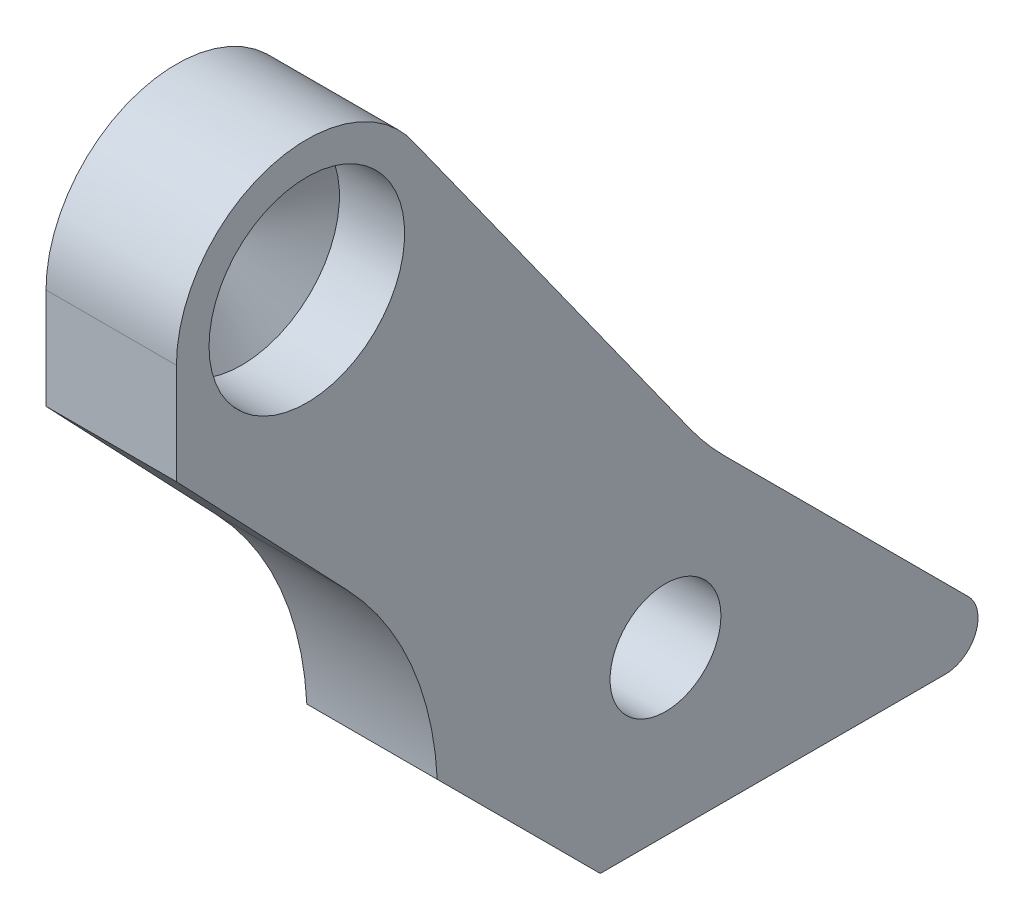
ISO-10303-21;
HEADER;
FILE_DESCRIPTION(('STEP AP214'),'2;1');
FILE_NAME('part.step','',(''),(''),'','','');
FILE_SCHEMA(('AUTOMOTIVE_DESIGN { 1 0 10303 214 1 1 1 1 }'));
ENDSEC;
DATA;
#1=APPLICATION_CONTEXT('core data for automotive mechanical design processes');
#2=APPLICATION_PROTOCOL_DEFINITION('international standard','automotive_design',2000,#1);
#3=PRODUCT_CONTEXT('',#1,'mechanical');
#4=PRODUCT('Part','Part','',(#3));
#5=PRODUCT_RELATED_PRODUCT_CATEGORY('part','',(#4));
#6=PRODUCT_DEFINITION_FORMATION('','',#4);
#7=PRODUCT_DEFINITION_CONTEXT('part definition',#1,'design');
#8=PRODUCT_DEFINITION('design','',#6,#7);
#9=PRODUCT_DEFINITION_SHAPE('','',#8);
#10=(LENGTH_UNIT() NAMED_UNIT(*) SI_UNIT(.MILLI.,.METRE.));
#11=(NAMED_UNIT(*) PLANE_ANGLE_UNIT() SI_UNIT($,.RADIAN.));
#12=(NAMED_UNIT(*) SI_UNIT($,.STERADIAN.) SOLID_ANGLE_UNIT());
#13=UNCERTAINTY_MEASURE_WITH_UNIT(LENGTH_MEASURE(1.E-05),#10,'distance_accuracy_value','');
#14=(GEOMETRIC_REPRESENTATION_CONTEXT(3) GLOBAL_UNCERTAINTY_ASSIGNED_CONTEXT((#13)) GLOBAL_UNIT_ASSIGNED_CONTEXT((#10,
#11,#12)) REPRESENTATION_CONTEXT('',''));
#15=CARTESIAN_POINT('',(0.,0.,0.));
#16=DIRECTION('',(0.,0.,1.));
#17=DIRECTION('',(1.,0.,0.));
#18=AXIS2_PLACEMENT_3D('',#15,#16,#17);
#19=CARTESIAN_POINT('',(-4.,0.,0.));
#20=DIRECTION('',(0.,0.689683794027428,-0.724110671276106));
#21=DIRECTION('',(0.,0.724110671276106,0.689683794027428));
#22=AXIS2_PLACEMENT_3D('',#19,#20,#21);
#23=PLANE('',#22);
#24=DIRECTION('',(0.,-0.724110671276106,-0.689683794027428));
#25=VECTOR('',#24,1.);
#26=CARTESIAN_POINT('',(0.,0.,0.));
#27=LINE('',#26,#25);
#28=CARTESIAN_POINT('',(0.,0.,0.));
#29=VERTEX_POINT('',#28);
#30=CARTESIAN_POINT('',(0.,-5.51611161748978,-5.25385543887186));
#31=VERTEX_POINT('',#30);
#32=EDGE_CURVE('E183',#29,#31,#27,.T.);
#33=ORIENTED_EDGE('',*,*,#32,.F.);
#34=DIRECTION('',(1.,0.,0.));
#35=VECTOR('',#34,1.);
#36=CARTESIAN_POINT('',(-4.,0.,0.));
#37=LINE('',#36,#35);
#38=CARTESIAN_POINT('',(-4.,0.,0.));
#39=VERTEX_POINT('',#38);
#40=EDGE_CURVE('E182',#39,#29,#37,.T.);
#41=ORIENTED_EDGE('',*,*,#40,.F.);
#42=DIRECTION('',(0.,-0.724110671276106,-0.689683794027428));
#43=VECTOR('',#42,1.);
#44=CARTESIAN_POINT('',(-4.,0.,0.));
#45=LINE('',#44,#43);
#46=CARTESIAN_POINT('',(-4.,-5.51611161748978,-5.25385543887186));
#47=VERTEX_POINT('',#46);
#48=EDGE_CURVE('E135',#39,#47,#45,.T.);
#49=ORIENTED_EDGE('',*,*,#48,.T.);
#50=DIRECTION('',(-1.,0.,0.));
#51=VECTOR('',#50,1.);
#52=CARTESIAN_POINT('',(-4.,-5.51611161748978,-5.25385543887187));
#53=LINE('',#52,#51);
#54=EDGE_CURVE('E121',#31,#47,#53,.T.);
#55=ORIENTED_EDGE('',*,*,#54,.F.);
#56=EDGE_LOOP('',(#33,#41,#49,#55));
#57=FACE_BOUND('',#56,.T.);
#58=ADVANCED_FACE('F39',(#57),#23,.F.);
#59=CARTESIAN_POINT('',(-4.,-11.9081605006336,-8.));
#60=DIRECTION('',(0.,0.707106781186548,-0.707106781186547));
#61=DIRECTION('',(0.,0.707106781186547,0.707106781186548));
#62=AXIS2_PLACEMENT_3D('',#59,#60,#61);
#63=PLANE('',#62);
#64=DIRECTION('',(0.,-0.707106781186547,-0.707106781186548));
#65=VECTOR('',#64,1.);
#66=CARTESIAN_POINT('',(0.,-11.9081605006336,-8.));
#67=LINE('',#66,#65);
#68=CARTESIAN_POINT('',(0.,-11.9081605006336,-8.));
#69=VERTEX_POINT('',#68);
#70=CARTESIAN_POINT('',(0.,-16.9081605006336,-13.));
#71=VERTEX_POINT('',#70);
#72=EDGE_CURVE('E139',#69,#71,#67,.T.);
#73=ORIENTED_EDGE('',*,*,#72,.F.);
#74=DIRECTION('',(1.,0.,0.));
#75=VECTOR('',#74,1.);
#76=CARTESIAN_POINT('',(-4.,-11.9081605006336,-8.));
#77=LINE('',#76,#75);
#78=CARTESIAN_POINT('',(-4.,-11.9081605006336,-8.));
#79=VERTEX_POINT('',#78);
#80=EDGE_CURVE('E118',#79,#69,#77,.T.);
#81=ORIENTED_EDGE('',*,*,#80,.F.);
#82=DIRECTION('',(0.,-0.707106781186547,-0.707106781186548));
#83=VECTOR('',#82,1.);
#84=CARTESIAN_POINT('',(-4.,-11.9081605006336,-8.));
#85=LINE('',#84,#83);
#86=CARTESIAN_POINT('',(-4.,-16.9081605006336,-13.));
#87=VERTEX_POINT('',#86);
#88=EDGE_CURVE('E128',#79,#87,#85,.T.);
#89=ORIENTED_EDGE('',*,*,#88,.T.);
#90=DIRECTION('',(1.,0.,0.));
#91=VECTOR('',#90,1.);
#92=CARTESIAN_POINT('',(-4.,-16.9081605006336,-13.));
#93=LINE('',#92,#91);
#94=EDGE_CURVE('E140',#87,#71,#93,.T.);
#95=ORIENTED_EDGE('',*,*,#94,.T.);
#96=EDGE_LOOP('',(#73,#81,#89,#95));
#97=FACE_BOUND('',#96,.T.);
#98=ADVANCED_FACE('F137',(#97),#63,.F.);
#99=CARTESIAN_POINT('',(-4.,-16.9081605006336,-13.));
#100=DIRECTION('',(0.,1.,0.));
#101=DIRECTION('',(0.,0.,1.));
#102=AXIS2_PLACEMENT_3D('',#99,#100,#101);
#103=PLANE('',#102);
#104=DIRECTION('',(0.,0.,-1.));
#105=VECTOR('',#104,1.);
#106=CARTESIAN_POINT('',(0.,-16.9081605006336,-13.));
#107=LINE('',#106,#105);
#108=CARTESIAN_POINT('',(0.,-16.9081605006336,-23.5857864376269));
#109=VERTEX_POINT('',#108);
#110=EDGE_CURVE('E188',#71,#109,#107,.T.);
#111=ORIENTED_EDGE('',*,*,#110,.F.);
#112=ORIENTED_EDGE('',*,*,#94,.F.);
#113=DIRECTION('',(0.,0.,-1.));
#114=VECTOR('',#113,1.);
#115=CARTESIAN_POINT('',(-4.,-16.9081605006336,-13.));
#116=LINE('',#115,#114);
#117=CARTESIAN_POINT('',(-4.,-16.9081605006336,-23.5857864376269));
#118=VERTEX_POINT('',#117);
#119=EDGE_CURVE('E131',#87,#118,#116,.T.);
#120=ORIENTED_EDGE('',*,*,#119,.T.);
#121=DIRECTION('',(1.,0.,0.));
#122=VECTOR('',#121,1.);
#123=CARTESIAN_POINT('',(-4.,-16.9081605006336,-23.5857864376269));
#124=LINE('',#123,#122);
#125=EDGE_CURVE('E47',#109,#118,#124,.F.);
#126=ORIENTED_EDGE('',*,*,#125,.F.);
#127=EDGE_LOOP('',(#111,#112,#120,#126));
#128=FACE_BOUND('',#127,.T.);
#129=ADVANCED_FACE('F167',(#128),#103,.F.);
#130=CARTESIAN_POINT('',(-4.,-16.9081605006336,-26.));
#131=DIRECTION('',(0.,-0.707106781186544,0.707106781186551));
#132=DIRECTION('',(0.,-0.707106781186551,-0.707106781186544));
#133=AXIS2_PLACEMENT_3D('',#130,#131,#132);
#134=PLANE('',#133);
#135=DIRECTION('',(0.,0.707106781186551,0.707106781186544));
#136=VECTOR('',#135,1.);
#137=CARTESIAN_POINT('',(-4.,-16.9081605006336,-26.));
#138=LINE('',#137,#136);
#139=CARTESIAN_POINT('',(-4.,-15.2010537194471,-24.2928932188135));
#140=VERTEX_POINT('',#139);
#141=CARTESIAN_POINT('',(-4.,-7.71714531588667,-16.8089848152531));
#142=VERTEX_POINT('',#141);
#143=EDGE_CURVE('E168',#140,#142,#138,.T.);
#144=ORIENTED_EDGE('',*,*,#143,.T.);
#145=DIRECTION('',(1.,0.,0.));
#146=VECTOR('',#145,1.);
#147=CARTESIAN_POINT('',(-4.,-7.71714531588667,-16.8089848152531));
#148=LINE('',#147,#146);
#149=CARTESIAN_POINT('',(0.,-7.71714531588667,-16.8089848152531));
#150=VERTEX_POINT('',#149);
#151=EDGE_CURVE('E155',#150,#142,#148,.F.);
#152=ORIENTED_EDGE('',*,*,#151,.F.);
#153=DIRECTION('',(0.,0.707106781186551,0.707106781186544));
#154=VECTOR('',#153,1.);
#155=CARTESIAN_POINT('',(0.,-16.9081605006336,-26.));
#156=LINE('',#155,#154);
#157=CARTESIAN_POINT('',(0.,-15.2010537194471,-24.2928932188135));
#158=VERTEX_POINT('',#157);
#159=EDGE_CURVE('E190',#158,#150,#156,.T.);
#160=ORIENTED_EDGE('',*,*,#159,.F.);
#161=DIRECTION('',(1.,0.,0.));
#162=VECTOR('',#161,1.);
#163=CARTESIAN_POINT('',(-4.,-15.2010537194471,-24.2928932188135));
#164=LINE('',#163,#162);
#165=EDGE_CURVE('E162',#140,#158,#164,.T.);
#166=ORIENTED_EDGE('',*,*,#165,.F.);
#167=EDGE_LOOP('',(#144,#152,#160,#166));
#168=FACE_BOUND('',#167,.T.);
#169=ADVANCED_FACE('F374',(#168),#134,.F.);
#170=CARTESIAN_POINT('',(-4.,5.25913739827213,-7.36196665917416));
#171=DIRECTION('',(0.,-0.581745374112938,0.81337096069272));
#172=DIRECTION('',(0.,-0.81337096069272,-0.581745374112938));
#173=AXIS2_PLACEMENT_3D('',#170,#171,#172);
#174=PLANE('',#173);
#175=DIRECTION('',(0.,0.81337096069272,0.581745374112938));
#176=VECTOR('',#175,1.);
#177=CARTESIAN_POINT('',(-4.,5.25913739827213,-7.36196665917416));
#178=LINE('',#177,#176);
#179=CARTESIAN_POINT('',(-4.,-6.46353124515061,-15.7463430201915));
#180=VERTEX_POINT('',#179);
#181=CARTESIAN_POINT('',(-4.,5.25913739827213,-7.36196665917416));
#182=VERTEX_POINT('',#181);
#183=EDGE_CURVE('E171',#180,#182,#178,.T.);
#184=ORIENTED_EDGE('',*,*,#183,.T.);
#185=DIRECTION('',(1.,0.,0.));
#186=VECTOR('',#185,1.);
#187=CARTESIAN_POINT('',(-4.,5.25913739827213,-7.36196665917416));
#188=LINE('',#187,#186);
#189=CARTESIAN_POINT('',(0.,5.25913739827213,-7.36196665917416));
#190=VERTEX_POINT('',#189);
#191=EDGE_CURVE('E144',#182,#190,#188,.T.);
#192=ORIENTED_EDGE('',*,*,#191,.T.);
#193=DIRECTION('',(0.,0.81337096069272,0.581745374112938));
#194=VECTOR('',#193,1.);
#195=CARTESIAN_POINT('',(0.,5.25913739827213,-7.36196665917416));
#196=LINE('',#195,#194);
#197=CARTESIAN_POINT('',(0.,-6.46353124515061,-15.7463430201915));
#198=VERTEX_POINT('',#197);
#199=EDGE_CURVE('E193',#198,#190,#196,.T.);
#200=ORIENTED_EDGE('',*,*,#199,.F.);
#201=DIRECTION('',(1.,0.,0.));
#202=VECTOR('',#201,1.);
#203=CARTESIAN_POINT('',(0.,-6.46353124515061,-15.7463430201914));
#204=LINE('',#203,#202);
#205=EDGE_CURVE('E142',#180,#198,#204,.T.);
#206=ORIENTED_EDGE('',*,*,#205,.F.);
#207=EDGE_LOOP('',(#184,#192,#200,#206));
#208=FACE_BOUND('',#207,.T.);
#209=ADVANCED_FACE('F209',(#208),#174,.F.);
#210=CARTESIAN_POINT('',(-4.,3.09183949936636,-4.));
#211=DIRECTION('',(1.,0.,0.));
#212=DIRECTION('',(0.,0.,1.));
#213=AXIS2_PLACEMENT_3D('',#210,#211,#212);
#214=CYLINDRICAL_SURFACE('',#213,4.);
#215=CARTESIAN_POINT('',(0.,3.09183949936636,-4.));
#216=DIRECTION('',(1.,0.,0.));
#217=DIRECTION('',(0.,0.,1.));
#218=AXIS2_PLACEMENT_3D('',#215,#216,#217);
#219=CIRCLE('',#218,4.);
#220=CARTESIAN_POINT('',(0.,3.09183949936636,0.));
#221=VERTEX_POINT('',#220);
#222=EDGE_CURVE('E196',#190,#221,#219,.T.);
#223=ORIENTED_EDGE('',*,*,#222,.F.);
#224=ORIENTED_EDGE('',*,*,#191,.F.);
#225=CARTESIAN_POINT('',(-4.,3.09183949936636,-4.));
#226=DIRECTION('',(1.,0.,0.));
#227=DIRECTION('',(0.,0.,1.));
#228=AXIS2_PLACEMENT_3D('',#225,#226,#227);
#229=CIRCLE('',#228,4.);
#230=CARTESIAN_POINT('',(-4.,3.09183949936636,0.));
#231=VERTEX_POINT('',#230);
#232=EDGE_CURVE('E177',#182,#231,#229,.T.);
#233=ORIENTED_EDGE('',*,*,#232,.T.);
#234=DIRECTION('',(1.,0.,0.));
#235=VECTOR('',#234,1.);
#236=CARTESIAN_POINT('',(-4.,3.09183949936636,0.));
#237=LINE('',#236,#235);
#238=EDGE_CURVE('E203',#231,#221,#237,.T.);
#239=ORIENTED_EDGE('',*,*,#238,.T.);
#240=EDGE_LOOP('',(#223,#224,#233,#239));
#241=FACE_BOUND('',#240,.T.);
#242=ADVANCED_FACE('F213',(#241),#214,.T.);
#243=CARTESIAN_POINT('',(-4.,0.,0.));
#244=DIRECTION('',(0.,0.,-1.));
#245=DIRECTION('',(1.,0.,0.));
#246=AXIS2_PLACEMENT_3D('',#243,#244,#245);
#247=PLANE('',#246);
#248=DIRECTION('',(0.,-1.,0.));
#249=VECTOR('',#248,1.);
#250=CARTESIAN_POINT('',(0.,0.,0.));
#251=LINE('',#250,#249);
#252=EDGE_CURVE('E199',#221,#29,#251,.T.);
#253=ORIENTED_EDGE('',*,*,#252,.F.);
#254=ORIENTED_EDGE('',*,*,#238,.F.);
#255=DIRECTION('',(0.,-1.,0.));
#256=VECTOR('',#255,1.);
#257=CARTESIAN_POINT('',(-4.,0.,0.));
#258=LINE('',#257,#256);
#259=EDGE_CURVE('E180',#231,#39,#258,.T.);
#260=ORIENTED_EDGE('',*,*,#259,.T.);
#261=ORIENTED_EDGE('',*,*,#40,.T.);
#262=EDGE_LOOP('',(#253,#254,#260,#261));
#263=FACE_BOUND('',#262,.T.);
#264=ADVANCED_FACE('F223',(#263),#247,.F.);
#265=CARTESIAN_POINT('',(-4.,3.09183949936636,-4.));
#266=DIRECTION('',(1.,0.,0.));
#267=DIRECTION('',(0.,0.,1.));
#268=AXIS2_PLACEMENT_3D('',#265,#266,#267);
#269=PLANE('',#268);
#270=CARTESIAN_POINT('',(-4.,-11.9081605006336,-15.));
#271=DIRECTION('',(1.,0.,0.));
#272=DIRECTION('',(0.,0.,-1.));
#273=AXIS2_PLACEMENT_3D('',#270,#271,#272);
#274=CIRCLE('',#273,3.15);
#275=CARTESIAN_POINT('',(-4.,-11.9081605006336,-18.15));
#276=VERTEX_POINT('',#275);
#277=EDGE_CURVE('E239',#276,#276,#274,.T.);
#278=ORIENTED_EDGE('',*,*,#277,.T.);
#279=EDGE_LOOP('',(#278));
#280=FACE_BOUND('',#279,.T.);
#281=CARTESIAN_POINT('',(-4.,3.09183949936636,-4.));
#282=DIRECTION('',(1.,0.,0.));
#283=DIRECTION('',(0.,0.,-1.));
#284=AXIS2_PLACEMENT_3D('',#281,#282,#283);
#285=CIRCLE('',#284,1.2);
#286=CARTESIAN_POINT('',(-4.,3.09183949936636,-5.2));
#287=VERTEX_POINT('',#286);
#288=EDGE_CURVE('E151',#287,#287,#285,.T.);
#289=ORIENTED_EDGE('',*,*,#288,.T.);
#290=EDGE_LOOP('',(#289));
#291=FACE_BOUND('',#290,.T.);
#292=ORIENTED_EDGE('',*,*,#119,.F.);
#293=ORIENTED_EDGE('',*,*,#88,.F.);
#294=CARTESIAN_POINT('',(-4.,-12.4129495577641,1.9872512738892));
#295=DIRECTION('',(-1.,0.,0.));
#296=DIRECTION('',(0.,0.,1.));
#297=AXIS2_PLACEMENT_3D('',#294,#295,#296);
#298=CIRCLE('',#297,10.);
#299=EDGE_CURVE('E114',#47,#79,#298,.T.);
#300=ORIENTED_EDGE('',*,*,#299,.F.);
#301=ORIENTED_EDGE('',*,*,#48,.F.);
#302=ORIENTED_EDGE('',*,*,#259,.F.);
#303=ORIENTED_EDGE('',*,*,#232,.F.);
#304=ORIENTED_EDGE('',*,*,#183,.F.);
#305=CARTESIAN_POINT('',(-4.,-0.646077504021231,-23.8800526271187));
#306=DIRECTION('',(-1.,0.,0.));
#307=DIRECTION('',(0.,0.,1.));
#308=AXIS2_PLACEMENT_3D('',#305,#306,#307);
#309=CIRCLE('',#308,10.);
#310=EDGE_CURVE('E160',#142,#180,#309,.T.);
#311=ORIENTED_EDGE('',*,*,#310,.F.);
#312=ORIENTED_EDGE('',*,*,#143,.F.);
#313=CARTESIAN_POINT('',(-4.,-15.9081605006336,-23.5857864376269));
#314=DIRECTION('',(-1.,0.,0.));
#315=DIRECTION('',(0.,0.,1.));
#316=AXIS2_PLACEMENT_3D('',#313,#314,#315);
#317=CIRCLE('',#316,1.);
#318=EDGE_CURVE('E11',#118,#140,#317,.F.);
#319=ORIENTED_EDGE('',*,*,#318,.F.);
#320=EDGE_LOOP('',(#292,#293,#300,#301,#302,#303,#304,#311,#312,#319));
#321=FACE_BOUND('',#320,.T.);
#322=ADVANCED_FACE('F129',(#280,#291,#321),#269,.F.);
#323=CARTESIAN_POINT('',(0.,3.09183949936636,-4.));
#324=DIRECTION('',(1.,0.,0.));
#325=DIRECTION('',(0.,0.,1.));
#326=AXIS2_PLACEMENT_3D('',#323,#324,#325);
#327=PLANE('',#326);
#328=CARTESIAN_POINT('',(0.,-11.9081605006336,-15.));
#329=DIRECTION('',(1.,0.,0.));
#330=DIRECTION('',(0.,0.,-1.));
#331=AXIS2_PLACEMENT_3D('',#328,#329,#330);
#332=CIRCLE('',#331,1.7);
#333=CARTESIAN_POINT('',(0.,-11.9081605006336,-16.7));
#334=VERTEX_POINT('',#333);
#335=EDGE_CURVE('E233',#334,#334,#332,.T.);
#336=ORIENTED_EDGE('',*,*,#335,.F.);
#337=EDGE_LOOP('',(#336));
#338=FACE_BOUND('',#337,.T.);
#339=CARTESIAN_POINT('',(0.,3.09183949936636,-4.));
#340=DIRECTION('',(-1.,0.,0.));
#341=DIRECTION('',(0.,0.,1.));
#342=AXIS2_PLACEMENT_3D('',#339,#340,#341);
#343=CIRCLE('',#342,2.99999999999999);
#344=CARTESIAN_POINT('',(0.,3.09183949936636,-1.00000000000001));
#345=VERTEX_POINT('',#344);
#346=EDGE_CURVE('E150',#345,#345,#343,.T.);
#347=ORIENTED_EDGE('',*,*,#346,.T.);
#348=EDGE_LOOP('',(#347));
#349=FACE_BOUND('',#348,.T.);
#350=ORIENTED_EDGE('',*,*,#159,.T.);
#351=CARTESIAN_POINT('',(0.,-0.646077504021231,-23.8800526271187));
#352=DIRECTION('',(-1.,0.,0.));
#353=DIRECTION('',(0.,0.,1.));
#354=AXIS2_PLACEMENT_3D('',#351,#352,#353);
#355=CIRCLE('',#354,10.);
#356=EDGE_CURVE('E124',#198,#150,#355,.F.);
#357=ORIENTED_EDGE('',*,*,#356,.F.);
#358=ORIENTED_EDGE('',*,*,#199,.T.);
#359=ORIENTED_EDGE('',*,*,#222,.T.);
#360=ORIENTED_EDGE('',*,*,#252,.T.);
#361=ORIENTED_EDGE('',*,*,#32,.T.);
#362=CARTESIAN_POINT('',(0.,-12.4129495577641,1.9872512738892));
#363=DIRECTION('',(-1.,0.,0.));
#364=DIRECTION('',(0.,0.,1.));
#365=AXIS2_PLACEMENT_3D('',#362,#363,#364);
#366=CIRCLE('',#365,10.);
#367=EDGE_CURVE('E125',#69,#31,#366,.F.);
#368=ORIENTED_EDGE('',*,*,#367,.F.);
#369=ORIENTED_EDGE('',*,*,#72,.T.);
#370=ORIENTED_EDGE('',*,*,#110,.T.);
#371=CARTESIAN_POINT('',(0.,-15.9081605006336,-23.5857864376269));
#372=DIRECTION('',(-1.,0.,0.));
#373=DIRECTION('',(0.,0.,1.));
#374=AXIS2_PLACEMENT_3D('',#371,#372,#373);
#375=CIRCLE('',#374,1.);
#376=EDGE_CURVE('E59',#158,#109,#375,.T.);
#377=ORIENTED_EDGE('',*,*,#376,.F.);
#378=EDGE_LOOP('',(#350,#357,#358,#359,#360,#361,#368,#369,#370,#377));
#379=FACE_BOUND('',#378,.T.);
#380=ADVANCED_FACE('F216',(#338,#349,#379),#327,.T.);
#381=CARTESIAN_POINT('',(-2.,3.09183949936636,-4.));
#382=DIRECTION('',(1.,0.,0.));
#383=DIRECTION('',(0.,0.,1.));
#384=AXIS2_PLACEMENT_3D('',#381,#382,#383);
#385=CONICAL_SURFACE('',#384,2.99999999999999,1.02974425867665);
#386=CARTESIAN_POINT('',(-3.08154911424961,3.09183949936636,-4.));
#387=DIRECTION('',(-1.,0.,0.));
#388=DIRECTION('',(0.,0.,1.));
#389=AXIS2_PLACEMENT_3D('',#386,#387,#388);
#390=CIRCLE('',#389,1.2);
#391=CARTESIAN_POINT('',(-3.08154911424961,3.09183949936636,-2.8));
#392=VERTEX_POINT('',#391);
#393=EDGE_CURVE('E148',#392,#392,#390,.F.);
#394=ORIENTED_EDGE('',*,*,#393,.F.);
#395=EDGE_LOOP('',(#394));
#396=FACE_BOUND('',#395,.T.);
#397=CARTESIAN_POINT('',(-2.,3.09183949936636,-4.));
#398=DIRECTION('',(-1.,0.,0.));
#399=DIRECTION('',(0.,0.,1.));
#400=AXIS2_PLACEMENT_3D('',#397,#398,#399);
#401=CIRCLE('',#400,2.99999999999999);
#402=CARTESIAN_POINT('',(-2.,3.09183949936636,-1.00000000000001));
#403=VERTEX_POINT('',#402);
#404=EDGE_CURVE('E186',#403,#403,#401,.T.);
#405=ORIENTED_EDGE('',*,*,#404,.F.);
#406=EDGE_LOOP('',(#405));
#407=FACE_BOUND('',#406,.T.);
#408=ADVANCED_FACE('F316',(#396,#407),#385,.F.);
#409=CARTESIAN_POINT('',(0.,3.09183949936636,-4.));
#410=DIRECTION('',(1.,0.,0.));
#411=DIRECTION('',(0.,0.,1.));
#412=AXIS2_PLACEMENT_3D('',#409,#410,#411);
#413=CYLINDRICAL_SURFACE('',#412,2.99999999999999);
#414=ORIENTED_EDGE('',*,*,#404,.T.);
#415=EDGE_LOOP('',(#414));
#416=FACE_BOUND('',#415,.T.);
#417=ORIENTED_EDGE('',*,*,#346,.F.);
#418=EDGE_LOOP('',(#417));
#419=FACE_BOUND('',#418,.T.);
#420=ADVANCED_FACE('F305',(#416,#419),#413,.F.);
#421=CARTESIAN_POINT('',(0.,3.09183949936636,-4.));
#422=DIRECTION('',(-1.,0.,0.));
#423=DIRECTION('',(0.,0.,-1.));
#424=AXIS2_PLACEMENT_3D('',#421,#422,#423);
#425=CYLINDRICAL_SURFACE('',#424,1.2);
#426=ORIENTED_EDGE('',*,*,#288,.F.);
#427=EDGE_LOOP('',(#426));
#428=FACE_BOUND('',#427,.T.);
#429=ORIENTED_EDGE('',*,*,#393,.T.);
#430=EDGE_LOOP('',(#429));
#431=FACE_BOUND('',#430,.T.);
#432=ADVANCED_FACE('F255',(#428,#431),#425,.F.);
#433=CARTESIAN_POINT('',(-4.,-11.9081605006336,-15.));
#434=DIRECTION('',(-1.,0.,0.));
#435=DIRECTION('',(0.,0.,-1.));
#436=AXIS2_PLACEMENT_3D('',#433,#434,#435);
#437=CYLINDRICAL_SURFACE('',#436,1.7);
#438=ORIENTED_EDGE('',*,*,#335,.T.);
#439=EDGE_LOOP('',(#438));
#440=FACE_BOUND('',#439,.T.);
#441=CARTESIAN_POINT('',(-2.55,-11.9081605006336,-15.));
#442=DIRECTION('',(1.,0.,0.));
#443=DIRECTION('',(0.,0.,-1.));
#444=AXIS2_PLACEMENT_3D('',#441,#442,#443);
#445=CIRCLE('',#444,1.7);
#446=CARTESIAN_POINT('',(-2.55,-11.9081605006336,-16.7));
#447=VERTEX_POINT('',#446);
#448=EDGE_CURVE('E236',#447,#447,#445,.T.);
#449=ORIENTED_EDGE('',*,*,#448,.F.);
#450=EDGE_LOOP('',(#449));
#451=FACE_BOUND('',#450,.T.);
#452=ADVANCED_FACE('F247',(#440,#451),#437,.F.);
#453=CARTESIAN_POINT('',(-4.,-11.9081605006336,-15.));
#454=DIRECTION('',(-1.,0.,0.));
#455=DIRECTION('',(0.,0.,-1.));
#456=AXIS2_PLACEMENT_3D('',#453,#454,#455);
#457=CONICAL_SURFACE('',#456,3.15,0.785398163397449);
#458=ORIENTED_EDGE('',*,*,#448,.T.);
#459=EDGE_LOOP('',(#458));
#460=FACE_BOUND('',#459,.T.);
#461=ORIENTED_EDGE('',*,*,#277,.F.);
#462=EDGE_LOOP('',(#461));
#463=FACE_BOUND('',#462,.T.);
#464=ADVANCED_FACE('F245',(#460,#463),#457,.F.);
#465=CARTESIAN_POINT('',(-4.,-12.4129495577641,1.9872512738892));
#466=DIRECTION('',(-1.,0.,0.));
#467=DIRECTION('',(0.,0.,-1.));
#468=AXIS2_PLACEMENT_3D('',#465,#466,#467);
#469=CYLINDRICAL_SURFACE('',#468,10.);
#470=ORIENTED_EDGE('',*,*,#299,.T.);
#471=ORIENTED_EDGE('',*,*,#80,.T.);
#472=ORIENTED_EDGE('',*,*,#367,.T.);
#473=ORIENTED_EDGE('',*,*,#54,.T.);
#474=EDGE_LOOP('',(#470,#471,#472,#473));
#475=FACE_BOUND('',#474,.T.);
#476=ADVANCED_FACE('F116',(#475),#469,.F.);
#477=CARTESIAN_POINT('',(-4.,-0.646077504021231,-23.8800526271187));
#478=DIRECTION('',(-1.,0.,0.));
#479=DIRECTION('',(0.,0.,-1.));
#480=AXIS2_PLACEMENT_3D('',#477,#478,#479);
#481=CYLINDRICAL_SURFACE('',#480,10.);
#482=ORIENTED_EDGE('',*,*,#310,.T.);
#483=ORIENTED_EDGE('',*,*,#205,.T.);
#484=ORIENTED_EDGE('',*,*,#356,.T.);
#485=ORIENTED_EDGE('',*,*,#151,.T.);
#486=EDGE_LOOP('',(#482,#483,#484,#485));
#487=FACE_BOUND('',#486,.T.);
#488=ADVANCED_FACE('F220',(#487),#481,.F.);
#489=CARTESIAN_POINT('',(-4.,-15.9081605006336,-23.5857864376269));
#490=DIRECTION('',(1.,0.,0.));
#491=DIRECTION('',(0.,0.,1.));
#492=AXIS2_PLACEMENT_3D('',#489,#490,#491);
#493=CYLINDRICAL_SURFACE('',#492,1.);
#494=ORIENTED_EDGE('',*,*,#318,.T.);
#495=ORIENTED_EDGE('',*,*,#165,.T.);
#496=ORIENTED_EDGE('',*,*,#376,.T.);
#497=ORIENTED_EDGE('',*,*,#125,.T.);
#498=EDGE_LOOP('',(#494,#495,#496,#497));
#499=FACE_BOUND('',#498,.T.);
#500=ADVANCED_FACE('F41',(#499),#493,.T.);
#501=CLOSED_SHELL('',(#58,#98,#129,#169,#209,#242,#264,#322,#380,#408,#420,#432,#452,#464,#476,
#488,#500));
#502=MANIFOLD_SOLID_BREP('B2',#501);
#503=ADVANCED_BREP_SHAPE_REPRESENTATION('',(#18,#502),#14);
#504=SHAPE_DEFINITION_REPRESENTATION(#9,#503);
ENDSEC;
END-ISO-10303-21;
